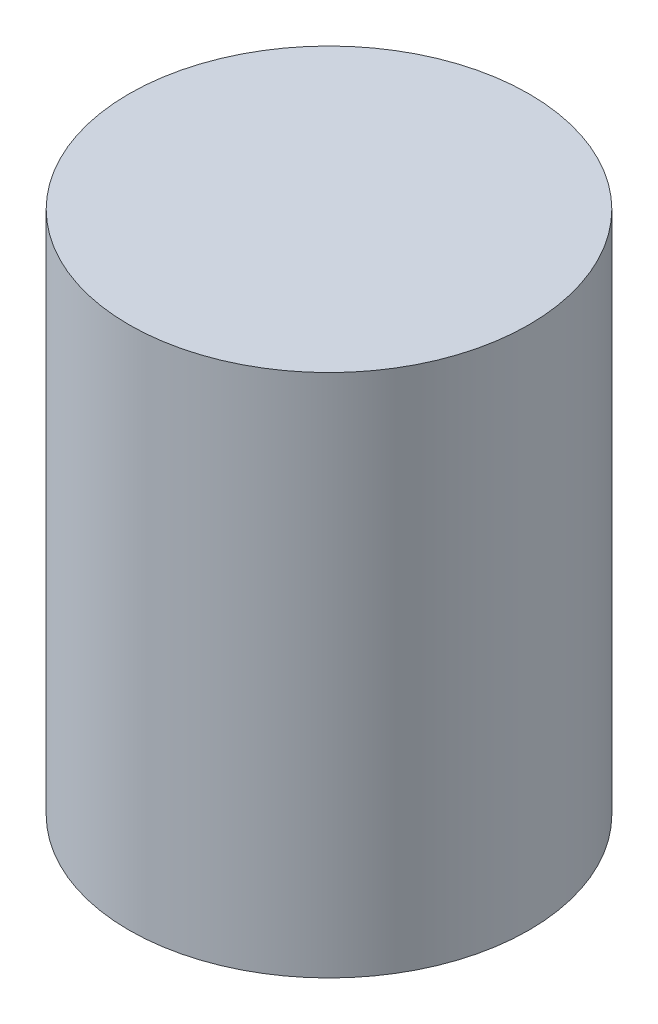
ISO-10303-21;
HEADER;
FILE_DESCRIPTION(('STEP AP214'),'2;1');
FILE_NAME('part.step','',(''),(''),'','','');
FILE_SCHEMA(('AUTOMOTIVE_DESIGN { 1 0 10303 214 1 1 1 1 }'));
ENDSEC;
DATA;
#1=APPLICATION_CONTEXT('core data for automotive mechanical design processes');
#2=APPLICATION_PROTOCOL_DEFINITION('international standard','automotive_design',2000,#1);
#3=PRODUCT_CONTEXT('',#1,'mechanical');
#4=PRODUCT('Part','Part','',(#3));
#5=PRODUCT_RELATED_PRODUCT_CATEGORY('part','',(#4));
#6=PRODUCT_DEFINITION_FORMATION('','',#4);
#7=PRODUCT_DEFINITION_CONTEXT('part definition',#1,'design');
#8=PRODUCT_DEFINITION('design','',#6,#7);
#9=PRODUCT_DEFINITION_SHAPE('','',#8);
#10=(LENGTH_UNIT() NAMED_UNIT(*) SI_UNIT(.MILLI.,.METRE.));
#11=(NAMED_UNIT(*) PLANE_ANGLE_UNIT() SI_UNIT($,.RADIAN.));
#12=(NAMED_UNIT(*) SI_UNIT($,.STERADIAN.) SOLID_ANGLE_UNIT());
#13=UNCERTAINTY_MEASURE_WITH_UNIT(LENGTH_MEASURE(1.E-05),#10,'distance_accuracy_value','');
#14=(GEOMETRIC_REPRESENTATION_CONTEXT(3) GLOBAL_UNCERTAINTY_ASSIGNED_CONTEXT((#13)) GLOBAL_UNIT_ASSIGNED_CONTEXT((#10,
#11,#12)) REPRESENTATION_CONTEXT('',''));
#15=CARTESIAN_POINT('',(0.,0.,0.));
#16=DIRECTION('',(0.,0.,1.));
#17=DIRECTION('',(1.,0.,0.));
#18=AXIS2_PLACEMENT_3D('',#15,#16,#17);
#19=CARTESIAN_POINT('',(0.,65.278,0.));
#20=DIRECTION('',(0.,-1.,0.));
#21=DIRECTION('',(0.,0.,1.));
#22=AXIS2_PLACEMENT_3D('',#19,#20,#21);
#23=CYLINDRICAL_SURFACE('',#22,24.9);
#24=CARTESIAN_POINT('',(0.,65.278,0.));
#25=DIRECTION('',(0.,-1.,0.));
#26=DIRECTION('',(0.,0.,-1.));
#27=AXIS2_PLACEMENT_3D('',#24,#25,#26);
#28=CIRCLE('',#27,24.9);
#29=CARTESIAN_POINT('',(0.,65.278,-24.9));
#30=VERTEX_POINT('',#29);
#31=EDGE_CURVE('E10',#30,#30,#28,.T.);
#32=ORIENTED_EDGE('',*,*,#31,.T.);
#33=EDGE_LOOP('',(#32));
#34=FACE_BOUND('',#33,.T.);
#35=CARTESIAN_POINT('',(0.,0.,0.));
#36=DIRECTION('',(0.,-1.,0.));
#37=DIRECTION('',(0.,0.,-1.));
#38=AXIS2_PLACEMENT_3D('',#35,#36,#37);
#39=CIRCLE('',#38,24.9);
#40=CARTESIAN_POINT('',(0.,0.,-24.9));
#41=VERTEX_POINT('',#40);
#42=EDGE_CURVE('E36',#41,#41,#39,.T.);
#43=ORIENTED_EDGE('',*,*,#42,.F.);
#44=EDGE_LOOP('',(#43));
#45=FACE_BOUND('',#44,.T.);
#46=ADVANCED_FACE('F33',(#34,#45),#23,.T.);
#47=CARTESIAN_POINT('',(0.,65.278,0.));
#48=DIRECTION('',(0.,1.,0.));
#49=DIRECTION('',(0.,0.,-1.));
#50=AXIS2_PLACEMENT_3D('',#47,#48,#49);
#51=PLANE('',#50);
#52=ORIENTED_EDGE('',*,*,#31,.F.);
#53=EDGE_LOOP('',(#52));
#54=FACE_BOUND('',#53,.T.);
#55=ADVANCED_FACE('F48',(#54),#51,.T.);
#56=CARTESIAN_POINT('',(0.,0.,0.));
#57=DIRECTION('',(0.,1.,0.));
#58=DIRECTION('',(0.,0.,-1.));
#59=AXIS2_PLACEMENT_3D('',#56,#57,#58);
#60=PLANE('',#59);
#61=ORIENTED_EDGE('',*,*,#42,.T.);
#62=EDGE_LOOP('',(#61));
#63=FACE_BOUND('',#62,.T.);
#64=ADVANCED_FACE('F45',(#63),#60,.F.);
#65=CLOSED_SHELL('',(#46,#55,#64));
#66=MANIFOLD_SOLID_BREP('B2',#65);
#67=ADVANCED_BREP_SHAPE_REPRESENTATION('',(#18,#66),#14);
#68=SHAPE_DEFINITION_REPRESENTATION(#9,#67);
ENDSEC;
END-ISO-10303-21;
